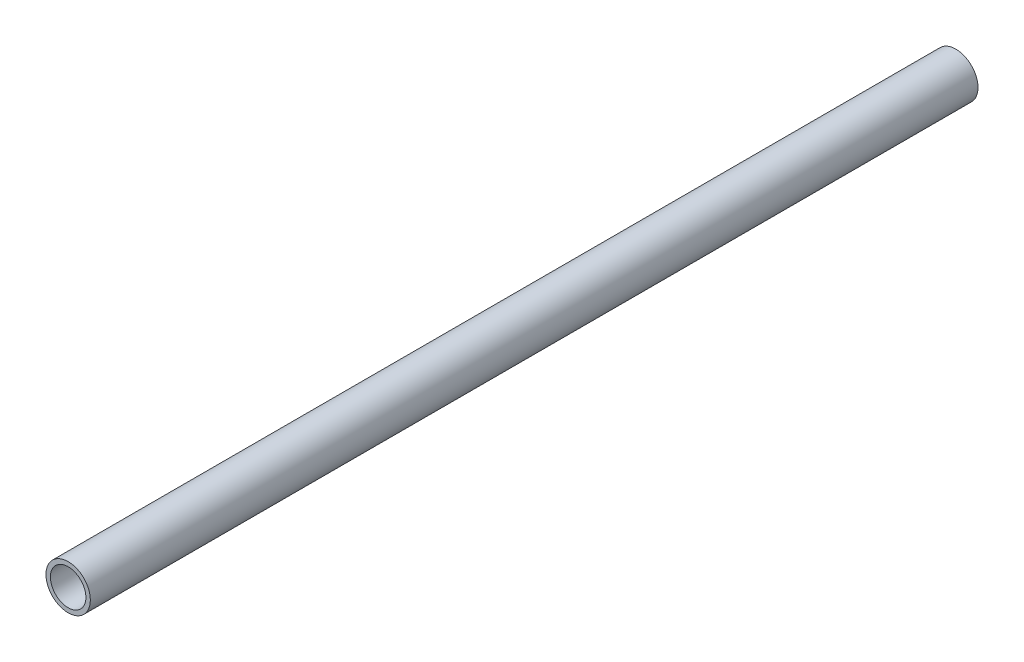
ISO-10303-21;
HEADER;
FILE_DESCRIPTION(('STEP AP214'),'2;1');
FILE_NAME('part.step','',(''),(''),'','','');
FILE_SCHEMA(('AUTOMOTIVE_DESIGN { 1 0 10303 214 1 1 1 1 }'));
ENDSEC;
DATA;
#1=APPLICATION_CONTEXT('core data for automotive mechanical design processes');
#2=APPLICATION_PROTOCOL_DEFINITION('international standard','automotive_design',2000,#1);
#3=PRODUCT_CONTEXT('',#1,'mechanical');
#4=PRODUCT('Part','Part','',(#3));
#5=PRODUCT_RELATED_PRODUCT_CATEGORY('part','',(#4));
#6=PRODUCT_DEFINITION_FORMATION('','',#4);
#7=PRODUCT_DEFINITION_CONTEXT('part definition',#1,'design');
#8=PRODUCT_DEFINITION('design','',#6,#7);
#9=PRODUCT_DEFINITION_SHAPE('','',#8);
#10=(LENGTH_UNIT() NAMED_UNIT(*) SI_UNIT(.MILLI.,.METRE.));
#11=(NAMED_UNIT(*) PLANE_ANGLE_UNIT() SI_UNIT($,.RADIAN.));
#12=(NAMED_UNIT(*) SI_UNIT($,.STERADIAN.) SOLID_ANGLE_UNIT());
#13=UNCERTAINTY_MEASURE_WITH_UNIT(LENGTH_MEASURE(1.E-05),#10,'distance_accuracy_value','');
#14=(GEOMETRIC_REPRESENTATION_CONTEXT(3) GLOBAL_UNCERTAINTY_ASSIGNED_CONTEXT((#13)) GLOBAL_UNIT_ASSIGNED_CONTEXT((#10,
#11,#12)) REPRESENTATION_CONTEXT('',''));
#15=CARTESIAN_POINT('',(0.,0.,0.));
#16=DIRECTION('',(0.,0.,1.));
#17=DIRECTION('',(1.,0.,0.));
#18=AXIS2_PLACEMENT_3D('',#15,#16,#17);
#19=CARTESIAN_POINT('',(0.,0.,250.));
#20=DIRECTION('',(0.,0.,1.));
#21=DIRECTION('',(1.,0.,0.));
#22=AXIS2_PLACEMENT_3D('',#19,#20,#21);
#23=PLANE('',#22);
#24=CARTESIAN_POINT('',(0.,0.,250.));
#25=DIRECTION('',(0.,0.,1.));
#26=DIRECTION('',(1.,0.,0.));
#27=AXIS2_PLACEMENT_3D('',#24,#25,#26);
#28=CIRCLE('',#27,12.5);
#29=CARTESIAN_POINT('',(12.5,0.,250.));
#30=VERTEX_POINT('',#29);
#31=EDGE_CURVE('E11',#30,#30,#28,.T.);
#32=ORIENTED_EDGE('',*,*,#31,.T.);
#33=EDGE_LOOP('',(#32));
#34=FACE_BOUND('',#33,.T.);
#35=CARTESIAN_POINT('',(0.,0.,250.));
#36=DIRECTION('',(0.,0.,1.));
#37=DIRECTION('',(1.,0.,0.));
#38=AXIS2_PLACEMENT_3D('',#35,#36,#37);
#39=CIRCLE('',#38,10.);
#40=CARTESIAN_POINT('',(10.,0.,250.));
#41=VERTEX_POINT('',#40);
#42=EDGE_CURVE('E47',#41,#41,#39,.T.);
#43=ORIENTED_EDGE('',*,*,#42,.F.);
#44=EDGE_LOOP('',(#43));
#45=FACE_BOUND('',#44,.T.);
#46=ADVANCED_FACE('F36',(#34,#45),#23,.T.);
#47=CARTESIAN_POINT('',(0.,0.,-250.));
#48=DIRECTION('',(0.,0.,1.));
#49=DIRECTION('',(1.,0.,0.));
#50=AXIS2_PLACEMENT_3D('',#47,#48,#49);
#51=PLANE('',#50);
#52=CARTESIAN_POINT('',(0.,0.,-250.));
#53=DIRECTION('',(0.,0.,1.));
#54=DIRECTION('',(1.,0.,0.));
#55=AXIS2_PLACEMENT_3D('',#52,#53,#54);
#56=CIRCLE('',#55,12.5);
#57=CARTESIAN_POINT('',(12.5,0.,-250.));
#58=VERTEX_POINT('',#57);
#59=EDGE_CURVE('E40',#58,#58,#56,.T.);
#60=ORIENTED_EDGE('',*,*,#59,.F.);
#61=EDGE_LOOP('',(#60));
#62=FACE_BOUND('',#61,.T.);
#63=CARTESIAN_POINT('',(0.,0.,-250.));
#64=DIRECTION('',(0.,0.,1.));
#65=DIRECTION('',(1.,0.,0.));
#66=AXIS2_PLACEMENT_3D('',#63,#64,#65);
#67=CIRCLE('',#66,10.);
#68=CARTESIAN_POINT('',(10.,0.,-250.));
#69=VERTEX_POINT('',#68);
#70=EDGE_CURVE('E49',#69,#69,#67,.T.);
#71=ORIENTED_EDGE('',*,*,#70,.T.);
#72=EDGE_LOOP('',(#71));
#73=FACE_BOUND('',#72,.T.);
#74=ADVANCED_FACE('F59',(#62,#73),#51,.F.);
#75=CARTESIAN_POINT('',(0.,0.,250.));
#76=DIRECTION('',(0.,0.,-1.));
#77=DIRECTION('',(-1.,0.,0.));
#78=AXIS2_PLACEMENT_3D('',#75,#76,#77);
#79=CYLINDRICAL_SURFACE('',#78,12.5);
#80=ORIENTED_EDGE('',*,*,#31,.F.);
#81=EDGE_LOOP('',(#80));
#82=FACE_BOUND('',#81,.T.);
#83=ORIENTED_EDGE('',*,*,#59,.T.);
#84=EDGE_LOOP('',(#83));
#85=FACE_BOUND('',#84,.T.);
#86=ADVANCED_FACE('F38',(#82,#85),#79,.T.);
#87=CARTESIAN_POINT('',(0.,0.,250.));
#88=DIRECTION('',(0.,0.,-1.));
#89=DIRECTION('',(-1.,0.,0.));
#90=AXIS2_PLACEMENT_3D('',#87,#88,#89);
#91=CYLINDRICAL_SURFACE('',#90,10.);
#92=ORIENTED_EDGE('',*,*,#42,.T.);
#93=EDGE_LOOP('',(#92));
#94=FACE_BOUND('',#93,.T.);
#95=ORIENTED_EDGE('',*,*,#70,.F.);
#96=EDGE_LOOP('',(#95));
#97=FACE_BOUND('',#96,.T.);
#98=ADVANCED_FACE('F55',(#94,#97),#91,.F.);
#99=CLOSED_SHELL('',(#46,#74,#86,#98));
#100=MANIFOLD_SOLID_BREP('B2',#99);
#101=ADVANCED_BREP_SHAPE_REPRESENTATION('',(#18,#100),#14);
#102=SHAPE_DEFINITION_REPRESENTATION(#9,#101);
ENDSEC;
END-ISO-10303-21;
